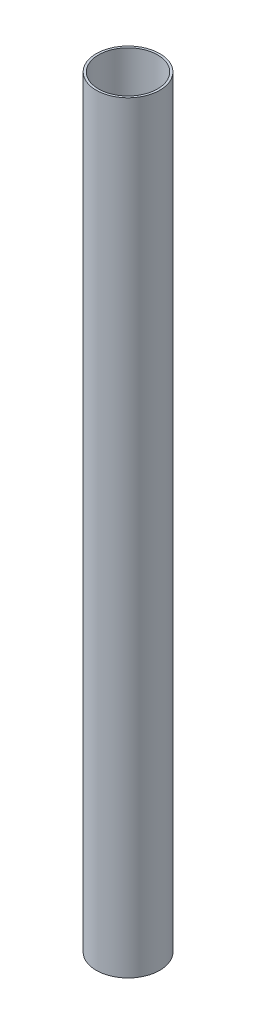
ISO-10303-21;
HEADER;
FILE_DESCRIPTION(('STEP AP214'),'2;1');
FILE_NAME('part.step','',(''),(''),'','','');
FILE_SCHEMA(('AUTOMOTIVE_DESIGN { 1 0 10303 214 1 1 1 1 }'));
ENDSEC;
DATA;
#1=APPLICATION_CONTEXT('core data for automotive mechanical design processes');
#2=APPLICATION_PROTOCOL_DEFINITION('international standard','automotive_design',2000,#1);
#3=PRODUCT_CONTEXT('',#1,'mechanical');
#4=PRODUCT('Part','Part','',(#3));
#5=PRODUCT_RELATED_PRODUCT_CATEGORY('part','',(#4));
#6=PRODUCT_DEFINITION_FORMATION('','',#4);
#7=PRODUCT_DEFINITION_CONTEXT('part definition',#1,'design');
#8=PRODUCT_DEFINITION('design','',#6,#7);
#9=PRODUCT_DEFINITION_SHAPE('','',#8);
#10=(LENGTH_UNIT() NAMED_UNIT(*) SI_UNIT(.MILLI.,.METRE.));
#11=(NAMED_UNIT(*) PLANE_ANGLE_UNIT() SI_UNIT($,.RADIAN.));
#12=(NAMED_UNIT(*) SI_UNIT($,.STERADIAN.) SOLID_ANGLE_UNIT());
#13=UNCERTAINTY_MEASURE_WITH_UNIT(LENGTH_MEASURE(1.E-05),#10,'distance_accuracy_value','');
#14=(GEOMETRIC_REPRESENTATION_CONTEXT(3) GLOBAL_UNCERTAINTY_ASSIGNED_CONTEXT((#13)) GLOBAL_UNIT_ASSIGNED_CONTEXT((#10,
#11,#12)) REPRESENTATION_CONTEXT('',''));
#15=CARTESIAN_POINT('',(0.,0.,0.));
#16=DIRECTION('',(0.,0.,1.));
#17=DIRECTION('',(1.,0.,0.));
#18=AXIS2_PLACEMENT_3D('',#15,#16,#17);
#19=CARTESIAN_POINT('',(0.,152.4,0.));
#20=DIRECTION('',(0.,1.,0.));
#21=DIRECTION('',(0.,0.,1.));
#22=AXIS2_PLACEMENT_3D('',#19,#20,#21);
#23=PLANE('',#22);
#24=CARTESIAN_POINT('',(0.,152.4,0.));
#25=DIRECTION('',(0.,1.,0.));
#26=DIRECTION('',(0.,0.,1.));
#27=AXIS2_PLACEMENT_3D('',#24,#25,#26);
#28=CIRCLE('',#27,12.7);
#29=CARTESIAN_POINT('',(0.,152.4,-12.7));
#30=VERTEX_POINT('',#29);
#31=EDGE_CURVE('E10',#30,#30,#28,.T.);
#32=ORIENTED_EDGE('',*,*,#31,.T.);
#33=EDGE_LOOP('',(#32));
#34=FACE_BOUND('',#33,.T.);
#35=CARTESIAN_POINT('',(0.,152.4,0.));
#36=DIRECTION('',(0.,1.,0.));
#37=DIRECTION('',(0.,0.,1.));
#38=AXIS2_PLACEMENT_3D('',#35,#36,#37);
#39=CIRCLE('',#38,11.811);
#40=CARTESIAN_POINT('',(0.,152.4,-11.811));
#41=VERTEX_POINT('',#40);
#42=EDGE_CURVE('E42',#41,#41,#39,.T.);
#43=ORIENTED_EDGE('',*,*,#42,.F.);
#44=EDGE_LOOP('',(#43));
#45=FACE_BOUND('',#44,.T.);
#46=ADVANCED_FACE('F31',(#34,#45),#23,.T.);
#47=CARTESIAN_POINT('',(0.,-152.4,0.));
#48=DIRECTION('',(0.,1.,0.));
#49=DIRECTION('',(0.,0.,1.));
#50=AXIS2_PLACEMENT_3D('',#47,#48,#49);
#51=PLANE('',#50);
#52=CARTESIAN_POINT('',(0.,-152.4,0.));
#53=DIRECTION('',(0.,1.,0.));
#54=DIRECTION('',(0.,0.,1.));
#55=AXIS2_PLACEMENT_3D('',#52,#53,#54);
#56=CIRCLE('',#55,12.7);
#57=CARTESIAN_POINT('',(0.,-152.4,-12.7));
#58=VERTEX_POINT('',#57);
#59=EDGE_CURVE('E35',#58,#58,#56,.T.);
#60=ORIENTED_EDGE('',*,*,#59,.F.);
#61=EDGE_LOOP('',(#60));
#62=FACE_BOUND('',#61,.T.);
#63=CARTESIAN_POINT('',(0.,-152.4,0.));
#64=DIRECTION('',(0.,1.,0.));
#65=DIRECTION('',(0.,0.,1.));
#66=AXIS2_PLACEMENT_3D('',#63,#64,#65);
#67=CIRCLE('',#66,11.811);
#68=CARTESIAN_POINT('',(0.,-152.4,-11.811));
#69=VERTEX_POINT('',#68);
#70=EDGE_CURVE('E44',#69,#69,#67,.T.);
#71=ORIENTED_EDGE('',*,*,#70,.T.);
#72=EDGE_LOOP('',(#71));
#73=FACE_BOUND('',#72,.T.);
#74=ADVANCED_FACE('F54',(#62,#73),#51,.F.);
#75=CARTESIAN_POINT('',(0.,152.4,0.));
#76=DIRECTION('',(0.,-1.,0.));
#77=DIRECTION('',(0.,0.,-1.));
#78=AXIS2_PLACEMENT_3D('',#75,#76,#77);
#79=CYLINDRICAL_SURFACE('',#78,12.7);
#80=CARTESIAN_POINT('',(0.,152.4,-12.7));
#81=CARTESIAN_POINT('',(0.,149.225,-12.7));
#82=CARTESIAN_POINT('',(0.,146.05,-12.7));
#83=CARTESIAN_POINT('',(0.,139.7,-12.7));
#84=CARTESIAN_POINT('',(0.,136.525,-12.7));
#85=CARTESIAN_POINT('',(0.,130.175,-12.7));
#86=CARTESIAN_POINT('',(0.,127.,-12.7));
#87=CARTESIAN_POINT('',(0.,120.65,-12.7));
#88=CARTESIAN_POINT('',(0.,117.475,-12.7));
#89=CARTESIAN_POINT('',(0.,111.125,-12.7));
#90=CARTESIAN_POINT('',(0.,107.95,-12.7));
#91=CARTESIAN_POINT('',(0.,101.6,-12.7));
#92=CARTESIAN_POINT('',(0.,98.425,-12.7));
#93=CARTESIAN_POINT('',(0.,92.075,-12.7));
#94=CARTESIAN_POINT('',(0.,88.9,-12.7));
#95=CARTESIAN_POINT('',(0.,82.55,-12.7));
#96=CARTESIAN_POINT('',(0.,79.375,-12.7));
#97=CARTESIAN_POINT('',(0.,73.025,-12.7));
#98=CARTESIAN_POINT('',(0.,69.85,-12.7));
#99=CARTESIAN_POINT('',(0.,63.5,-12.7));
#100=CARTESIAN_POINT('',(0.,60.325,-12.7));
#101=CARTESIAN_POINT('',(0.,53.975,-12.7));
#102=CARTESIAN_POINT('',(0.,50.8,-12.7));
#103=CARTESIAN_POINT('',(0.,44.45,-12.7));
#104=CARTESIAN_POINT('',(0.,41.275,-12.7));
#105=CARTESIAN_POINT('',(0.,34.925,-12.7));
#106=CARTESIAN_POINT('',(0.,31.75,-12.7));
#107=CARTESIAN_POINT('',(0.,25.4,-12.7));
#108=CARTESIAN_POINT('',(0.,22.225,-12.7));
#109=CARTESIAN_POINT('',(0.,15.875,-12.7));
#110=CARTESIAN_POINT('',(0.,12.7,-12.7));
#111=CARTESIAN_POINT('',(0.,6.35,-12.7));
#112=CARTESIAN_POINT('',(0.,3.175,-12.7));
#113=CARTESIAN_POINT('',(0.,-3.175,-12.7));
#114=CARTESIAN_POINT('',(0.,-6.35,-12.7));
#115=CARTESIAN_POINT('',(0.,-12.7,-12.7));
#116=CARTESIAN_POINT('',(0.,-15.875,-12.7));
#117=CARTESIAN_POINT('',(0.,-22.225,-12.7));
#118=CARTESIAN_POINT('',(0.,-25.4,-12.7));
#119=CARTESIAN_POINT('',(0.,-31.75,-12.7));
#120=CARTESIAN_POINT('',(0.,-34.925,-12.7));
#121=CARTESIAN_POINT('',(0.,-41.275,-12.7));
#122=CARTESIAN_POINT('',(0.,-44.45,-12.7));
#123=CARTESIAN_POINT('',(0.,-50.8,-12.7));
#124=CARTESIAN_POINT('',(0.,-53.975,-12.7));
#125=CARTESIAN_POINT('',(0.,-60.325,-12.7));
#126=CARTESIAN_POINT('',(0.,-63.5,-12.7));
#127=CARTESIAN_POINT('',(0.,-69.85,-12.7));
#128=CARTESIAN_POINT('',(0.,-73.025,-12.7));
#129=CARTESIAN_POINT('',(0.,-79.375,-12.7));
#130=CARTESIAN_POINT('',(0.,-82.55,-12.7));
#131=CARTESIAN_POINT('',(0.,-88.9,-12.7));
#132=CARTESIAN_POINT('',(0.,-92.075,-12.7));
#133=CARTESIAN_POINT('',(0.,-98.425,-12.7));
#134=CARTESIAN_POINT('',(0.,-101.6,-12.7));
#135=CARTESIAN_POINT('',(0.,-107.95,-12.7));
#136=CARTESIAN_POINT('',(0.,-111.125,-12.7));
#137=CARTESIAN_POINT('',(0.,-117.475,-12.7));
#138=CARTESIAN_POINT('',(0.,-120.65,-12.7));
#139=CARTESIAN_POINT('',(0.,-127.,-12.7));
#140=CARTESIAN_POINT('',(0.,-130.175,-12.7));
#141=CARTESIAN_POINT('',(0.,-136.525,-12.7));
#142=CARTESIAN_POINT('',(0.,-139.7,-12.7));
#143=CARTESIAN_POINT('',(0.,-146.05,-12.7));
#144=CARTESIAN_POINT('',(0.,-149.225,-12.7));
#145=CARTESIAN_POINT('',(0.,-152.4,-12.7));
#146=B_SPLINE_CURVE_WITH_KNOTS('',3,(#80,#81,#82,#83,#84,#85,#86,#87,#88,#89,#90,#91,#92,#93,
#94,#95,#96,#97,#98,#99,#100,#101,#102,#103,#104,#105,#106,#107,#108,#109,#110,#111,#112,#113,
#114,#115,#116,#117,#118,#119,#120,#121,#122,#123,#124,#125,#126,#127,#128,#129,#130,#131,#132,
#133,#134,#135,#136,#137,#138,#139,#140,#141,#142,#143,#144,#145),.UNSPECIFIED.,.F.,.F.,(4,2,2,
2,2,2,2,2,2,2,2,2,2,2,2,2,2,2,2,2,2,2,2,2,2,2,2,2,2,2,2,2,4),(0.,9.52500000000001,19.05,28.575,
38.1,47.625,57.15,66.675,76.2,85.725,95.25,104.775,114.3,123.825,133.35,142.875,152.4,161.925,
171.45,180.975,190.5,200.025,209.55,219.075,228.6,238.125,247.65,257.175,266.7,276.225,285.75,
295.275,304.8),.UNSPECIFIED.);
#147=EDGE_CURVE('BSEAM33',#30,#58,#146,.T.);
#148=ORIENTED_EDGE('',*,*,#31,.F.);
#149=ORIENTED_EDGE('',*,*,#59,.T.);
#150=ORIENTED_EDGE('',*,*,#147,.T.);
#151=ORIENTED_EDGE('',*,*,#147,.F.);
#152=EDGE_LOOP('',(#148,#150,#149,#151));
#153=FACE_BOUND('',#152,.T.);
#154=ADVANCED_FACE('F33',(#153),#79,.T.);
#155=CARTESIAN_POINT('',(0.,152.4,0.));
#156=DIRECTION('',(0.,-1.,0.));
#157=DIRECTION('',(0.,0.,-1.));
#158=AXIS2_PLACEMENT_3D('',#155,#156,#157);
#159=CYLINDRICAL_SURFACE('',#158,11.811);
#160=CARTESIAN_POINT('',(0.,152.4,-11.811));
#161=CARTESIAN_POINT('',(0.,149.225,-11.811));
#162=CARTESIAN_POINT('',(0.,146.05,-11.811));
#163=CARTESIAN_POINT('',(0.,139.7,-11.811));
#164=CARTESIAN_POINT('',(0.,136.525,-11.811));
#165=CARTESIAN_POINT('',(0.,130.175,-11.811));
#166=CARTESIAN_POINT('',(0.,127.,-11.811));
#167=CARTESIAN_POINT('',(0.,120.65,-11.811));
#168=CARTESIAN_POINT('',(0.,117.475,-11.811));
#169=CARTESIAN_POINT('',(0.,111.125,-11.811));
#170=CARTESIAN_POINT('',(0.,107.95,-11.811));
#171=CARTESIAN_POINT('',(0.,101.6,-11.811));
#172=CARTESIAN_POINT('',(0.,98.425,-11.811));
#173=CARTESIAN_POINT('',(0.,92.075,-11.811));
#174=CARTESIAN_POINT('',(0.,88.9,-11.811));
#175=CARTESIAN_POINT('',(0.,82.55,-11.811));
#176=CARTESIAN_POINT('',(0.,79.375,-11.811));
#177=CARTESIAN_POINT('',(0.,73.025,-11.811));
#178=CARTESIAN_POINT('',(0.,69.85,-11.811));
#179=CARTESIAN_POINT('',(0.,63.5,-11.811));
#180=CARTESIAN_POINT('',(0.,60.325,-11.811));
#181=CARTESIAN_POINT('',(0.,53.975,-11.811));
#182=CARTESIAN_POINT('',(0.,50.8,-11.811));
#183=CARTESIAN_POINT('',(0.,44.45,-11.811));
#184=CARTESIAN_POINT('',(0.,41.275,-11.811));
#185=CARTESIAN_POINT('',(0.,34.925,-11.811));
#186=CARTESIAN_POINT('',(0.,31.75,-11.811));
#187=CARTESIAN_POINT('',(0.,25.4,-11.811));
#188=CARTESIAN_POINT('',(0.,22.225,-11.811));
#189=CARTESIAN_POINT('',(0.,15.875,-11.811));
#190=CARTESIAN_POINT('',(0.,12.7,-11.811));
#191=CARTESIAN_POINT('',(0.,6.35,-11.811));
#192=CARTESIAN_POINT('',(0.,3.175,-11.811));
#193=CARTESIAN_POINT('',(0.,-3.175,-11.811));
#194=CARTESIAN_POINT('',(0.,-6.35,-11.811));
#195=CARTESIAN_POINT('',(0.,-12.7,-11.811));
#196=CARTESIAN_POINT('',(0.,-15.875,-11.811));
#197=CARTESIAN_POINT('',(0.,-22.225,-11.811));
#198=CARTESIAN_POINT('',(0.,-25.4,-11.811));
#199=CARTESIAN_POINT('',(0.,-31.75,-11.811));
#200=CARTESIAN_POINT('',(0.,-34.925,-11.811));
#201=CARTESIAN_POINT('',(0.,-41.275,-11.811));
#202=CARTESIAN_POINT('',(0.,-44.45,-11.811));
#203=CARTESIAN_POINT('',(0.,-50.8,-11.811));
#204=CARTESIAN_POINT('',(0.,-53.975,-11.811));
#205=CARTESIAN_POINT('',(0.,-60.325,-11.811));
#206=CARTESIAN_POINT('',(0.,-63.5,-11.811));
#207=CARTESIAN_POINT('',(0.,-69.85,-11.811));
#208=CARTESIAN_POINT('',(0.,-73.025,-11.811));
#209=CARTESIAN_POINT('',(0.,-79.375,-11.811));
#210=CARTESIAN_POINT('',(0.,-82.55,-11.811));
#211=CARTESIAN_POINT('',(0.,-88.9,-11.811));
#212=CARTESIAN_POINT('',(0.,-92.075,-11.811));
#213=CARTESIAN_POINT('',(0.,-98.425,-11.811));
#214=CARTESIAN_POINT('',(0.,-101.6,-11.811));
#215=CARTESIAN_POINT('',(0.,-107.95,-11.811));
#216=CARTESIAN_POINT('',(0.,-111.125,-11.811));
#217=CARTESIAN_POINT('',(0.,-117.475,-11.811));
#218=CARTESIAN_POINT('',(0.,-120.65,-11.811));
#219=CARTESIAN_POINT('',(0.,-127.,-11.811));
#220=CARTESIAN_POINT('',(0.,-130.175,-11.811));
#221=CARTESIAN_POINT('',(0.,-136.525,-11.811));
#222=CARTESIAN_POINT('',(0.,-139.7,-11.811));
#223=CARTESIAN_POINT('',(0.,-146.05,-11.811));
#224=CARTESIAN_POINT('',(0.,-149.225,-11.811));
#225=CARTESIAN_POINT('',(0.,-152.4,-11.811));
#226=B_SPLINE_CURVE_WITH_KNOTS('',3,(#160,#161,#162,#163,#164,#165,#166,#167,#168,#169,#170,
#171,#172,#173,#174,#175,#176,#177,#178,#179,#180,#181,#182,#183,#184,#185,#186,#187,#188,#189,
#190,#191,#192,#193,#194,#195,#196,#197,#198,#199,#200,#201,#202,#203,#204,#205,#206,#207,#208,
#209,#210,#211,#212,#213,#214,#215,#216,#217,#218,#219,#220,#221,#222,#223,#224,#225),
.UNSPECIFIED.,.F.,.F.,(4,2,2,2,2,2,2,2,2,2,2,2,2,2,2,2,2,2,2,2,2,2,2,2,2,2,2,2,2,2,2,2,4),(0.,
9.52500000000001,19.05,28.575,38.1,47.625,57.15,66.675,76.2,85.725,95.25,104.775,114.3,123.825,
133.35,142.875,152.4,161.925,171.45,180.975,190.5,200.025,209.55,219.075,228.6,238.125,247.65,
257.175,266.7,276.225,285.75,295.275,304.8),.UNSPECIFIED.);
#227=EDGE_CURVE('BSEAM50',#41,#69,#226,.T.);
#228=ORIENTED_EDGE('',*,*,#42,.T.);
#229=ORIENTED_EDGE('',*,*,#70,.F.);
#230=ORIENTED_EDGE('',*,*,#227,.T.);
#231=ORIENTED_EDGE('',*,*,#227,.F.);
#232=EDGE_LOOP('',(#228,#230,#229,#231));
#233=FACE_BOUND('',#232,.T.);
#234=ADVANCED_FACE('F50',(#233),#159,.F.);
#235=CLOSED_SHELL('',(#46,#74,#154,#234));
#236=MANIFOLD_SOLID_BREP('B2',#235);
#237=ADVANCED_BREP_SHAPE_REPRESENTATION('',(#18,#236),#14);
#238=SHAPE_DEFINITION_REPRESENTATION(#9,#237);
ENDSEC;
END-ISO-10303-21;
